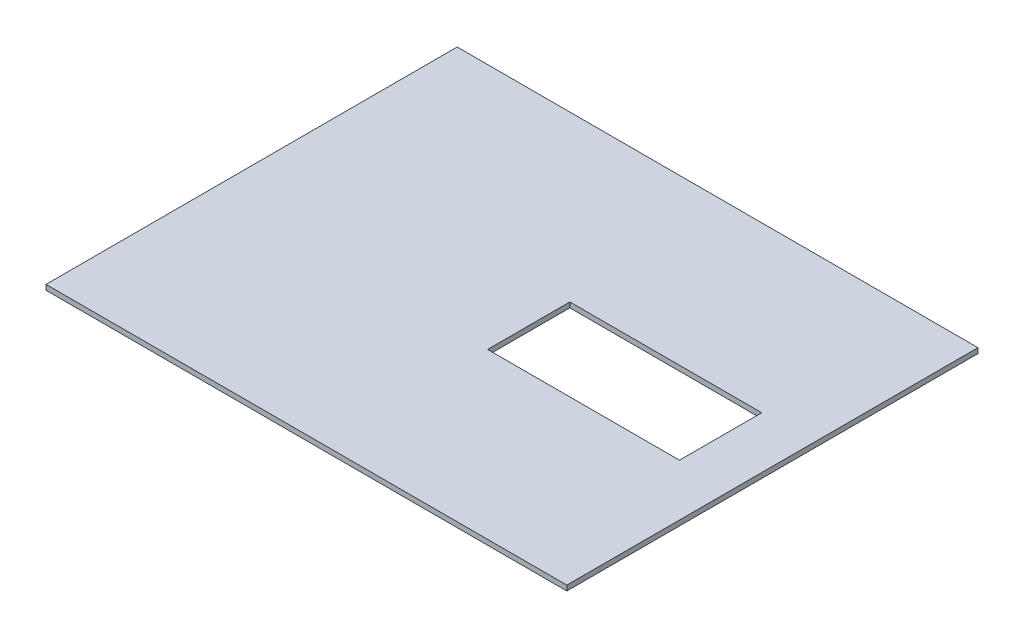
ISO-10303-21;
HEADER;
FILE_DESCRIPTION(('STEP AP214'),'2;1');
FILE_NAME('part.step','',(''),(''),'','','');
FILE_SCHEMA(('AUTOMOTIVE_DESIGN { 1 0 10303 214 1 1 1 1 }'));
ENDSEC;
DATA;
#1=APPLICATION_CONTEXT('core data for automotive mechanical design processes');
#2=APPLICATION_PROTOCOL_DEFINITION('international standard','automotive_design',2000,#1);
#3=PRODUCT_CONTEXT('',#1,'mechanical');
#4=PRODUCT('Part','Part','',(#3));
#5=PRODUCT_RELATED_PRODUCT_CATEGORY('part','',(#4));
#6=PRODUCT_DEFINITION_FORMATION('','',#4);
#7=PRODUCT_DEFINITION_CONTEXT('part definition',#1,'design');
#8=PRODUCT_DEFINITION('design','',#6,#7);
#9=PRODUCT_DEFINITION_SHAPE('','',#8);
#10=(LENGTH_UNIT() NAMED_UNIT(*) SI_UNIT(.MILLI.,.METRE.));
#11=(NAMED_UNIT(*) PLANE_ANGLE_UNIT() SI_UNIT($,.RADIAN.));
#12=(NAMED_UNIT(*) SI_UNIT($,.STERADIAN.) SOLID_ANGLE_UNIT());
#13=UNCERTAINTY_MEASURE_WITH_UNIT(LENGTH_MEASURE(1.E-05),#10,'distance_accuracy_value','');
#14=(GEOMETRIC_REPRESENTATION_CONTEXT(3) GLOBAL_UNCERTAINTY_ASSIGNED_CONTEXT((#13)) GLOBAL_UNIT_ASSIGNED_CONTEXT((#10,
#11,#12)) REPRESENTATION_CONTEXT('',''));
#15=CARTESIAN_POINT('',(0.,0.,0.));
#16=DIRECTION('',(0.,0.,1.));
#17=DIRECTION('',(1.,0.,0.));
#18=AXIS2_PLACEMENT_3D('',#15,#16,#17);
#19=CARTESIAN_POINT('',(241.3,4.7625,-190.5));
#20=DIRECTION('',(-1.,0.,0.));
#21=DIRECTION('',(0.,0.,1.));
#22=AXIS2_PLACEMENT_3D('',#19,#20,#21);
#23=PLANE('',#22);
#24=DIRECTION('',(0.,0.,-1.));
#25=VECTOR('',#24,1.);
#26=CARTESIAN_POINT('',(241.3,0.,-190.5));
#27=LINE('',#26,#25);
#28=CARTESIAN_POINT('',(241.3,0.,190.5));
#29=VERTEX_POINT('',#28);
#30=CARTESIAN_POINT('',(241.3,0.,-190.5));
#31=VERTEX_POINT('',#30);
#32=EDGE_CURVE('E127',#29,#31,#27,.T.);
#33=ORIENTED_EDGE('',*,*,#32,.T.);
#34=DIRECTION('',(0.,-1.,0.));
#35=VECTOR('',#34,1.);
#36=CARTESIAN_POINT('',(241.3,4.7625,-190.5));
#37=LINE('',#36,#35);
#38=CARTESIAN_POINT('',(241.3,4.7625,-190.5));
#39=VERTEX_POINT('',#38);
#40=EDGE_CURVE('E11',#39,#31,#37,.T.);
#41=ORIENTED_EDGE('',*,*,#40,.F.);
#42=DIRECTION('',(0.,0.,-1.));
#43=VECTOR('',#42,1.);
#44=CARTESIAN_POINT('',(241.3,4.7625,-190.5));
#45=LINE('',#44,#43);
#46=CARTESIAN_POINT('',(241.3,4.7625,190.5));
#47=VERTEX_POINT('',#46);
#48=EDGE_CURVE('E129',#47,#39,#45,.T.);
#49=ORIENTED_EDGE('',*,*,#48,.F.);
#50=DIRECTION('',(0.,-1.,0.));
#51=VECTOR('',#50,1.);
#52=CARTESIAN_POINT('',(241.3,4.7625,190.5));
#53=LINE('',#52,#51);
#54=EDGE_CURVE('E139',#47,#29,#53,.T.);
#55=ORIENTED_EDGE('',*,*,#54,.T.);
#56=EDGE_LOOP('',(#33,#41,#49,#55));
#57=FACE_BOUND('',#56,.T.);
#58=ADVANCED_FACE('F33',(#57),#23,.F.);
#59=CARTESIAN_POINT('',(-241.3,4.7625,-190.5));
#60=DIRECTION('',(0.,0.,1.));
#61=DIRECTION('',(1.,0.,0.));
#62=AXIS2_PLACEMENT_3D('',#59,#60,#61);
#63=PLANE('',#62);
#64=DIRECTION('',(-1.,0.,0.));
#65=VECTOR('',#64,1.);
#66=CARTESIAN_POINT('',(-241.3,0.,-190.5));
#67=LINE('',#66,#65);
#68=CARTESIAN_POINT('',(-241.3,0.,-190.5));
#69=VERTEX_POINT('',#68);
#70=EDGE_CURVE('E142',#31,#69,#67,.T.);
#71=ORIENTED_EDGE('',*,*,#70,.T.);
#72=DIRECTION('',(0.,-1.,0.));
#73=VECTOR('',#72,1.);
#74=CARTESIAN_POINT('',(-241.3,4.7625,-190.5));
#75=LINE('',#74,#73);
#76=CARTESIAN_POINT('',(-241.3,4.7625,-190.5));
#77=VERTEX_POINT('',#76);
#78=EDGE_CURVE('E40',#77,#69,#75,.T.);
#79=ORIENTED_EDGE('',*,*,#78,.F.);
#80=DIRECTION('',(-1.,0.,0.));
#81=VECTOR('',#80,1.);
#82=CARTESIAN_POINT('',(-241.3,4.7625,-190.5));
#83=LINE('',#82,#81);
#84=EDGE_CURVE('E132',#39,#77,#83,.T.);
#85=ORIENTED_EDGE('',*,*,#84,.F.);
#86=ORIENTED_EDGE('',*,*,#40,.T.);
#87=EDGE_LOOP('',(#71,#79,#85,#86));
#88=FACE_BOUND('',#87,.T.);
#89=ADVANCED_FACE('F170',(#88),#63,.F.);
#90=CARTESIAN_POINT('',(-241.3,4.7625,-190.5));
#91=DIRECTION('',(1.,0.,0.));
#92=DIRECTION('',(0.,0.,-1.));
#93=AXIS2_PLACEMENT_3D('',#90,#91,#92);
#94=PLANE('',#93);
#95=DIRECTION('',(0.,0.,1.));
#96=VECTOR('',#95,1.);
#97=CARTESIAN_POINT('',(-241.3,0.,-190.5));
#98=LINE('',#97,#96);
#99=CARTESIAN_POINT('',(-241.3,0.,190.5));
#100=VERTEX_POINT('',#99);
#101=EDGE_CURVE('E144',#69,#100,#98,.T.);
#102=ORIENTED_EDGE('',*,*,#101,.T.);
#103=DIRECTION('',(0.,-1.,0.));
#104=VECTOR('',#103,1.);
#105=CARTESIAN_POINT('',(-241.3,4.7625,190.5));
#106=LINE('',#105,#104);
#107=CARTESIAN_POINT('',(-241.3,4.7625,190.5));
#108=VERTEX_POINT('',#107);
#109=EDGE_CURVE('E149',#108,#100,#106,.T.);
#110=ORIENTED_EDGE('',*,*,#109,.F.);
#111=DIRECTION('',(0.,0.,1.));
#112=VECTOR('',#111,1.);
#113=CARTESIAN_POINT('',(-241.3,4.7625,-190.5));
#114=LINE('',#113,#112);
#115=EDGE_CURVE('E135',#77,#108,#114,.T.);
#116=ORIENTED_EDGE('',*,*,#115,.F.);
#117=ORIENTED_EDGE('',*,*,#78,.T.);
#118=EDGE_LOOP('',(#102,#110,#116,#117));
#119=FACE_BOUND('',#118,.T.);
#120=ADVANCED_FACE('F156',(#119),#94,.F.);
#121=CARTESIAN_POINT('',(-241.3,4.7625,190.5));
#122=DIRECTION('',(0.,0.,-1.));
#123=DIRECTION('',(-1.,0.,0.));
#124=AXIS2_PLACEMENT_3D('',#121,#122,#123);
#125=PLANE('',#124);
#126=DIRECTION('',(1.,0.,0.));
#127=VECTOR('',#126,1.);
#128=CARTESIAN_POINT('',(-241.3,0.,190.5));
#129=LINE('',#128,#127);
#130=EDGE_CURVE('E133',#100,#29,#129,.T.);
#131=ORIENTED_EDGE('',*,*,#130,.T.);
#132=ORIENTED_EDGE('',*,*,#54,.F.);
#133=DIRECTION('',(1.,0.,0.));
#134=VECTOR('',#133,1.);
#135=CARTESIAN_POINT('',(-241.3,4.7625,190.5));
#136=LINE('',#135,#134);
#137=EDGE_CURVE('E137',#108,#47,#136,.T.);
#138=ORIENTED_EDGE('',*,*,#137,.F.);
#139=ORIENTED_EDGE('',*,*,#109,.T.);
#140=EDGE_LOOP('',(#131,#132,#138,#139));
#141=FACE_BOUND('',#140,.T.);
#142=ADVANCED_FACE('F165',(#141),#125,.F.);
#143=CARTESIAN_POINT('',(0.,4.7625,0.));
#144=DIRECTION('',(0.,1.,0.));
#145=DIRECTION('',(0.,0.,1.));
#146=AXIS2_PLACEMENT_3D('',#143,#144,#145);
#147=PLANE('',#146);
#148=DIRECTION('',(0.,0.,-1.));
#149=VECTOR('',#148,1.);
#150=CARTESIAN_POINT('',(193.294,4.7625,38.1));
#151=LINE('',#150,#149);
#152=CARTESIAN_POINT('',(193.294,4.7625,38.1));
#153=VERTEX_POINT('',#152);
#154=CARTESIAN_POINT('',(193.294,4.7625,-38.1));
#155=VERTEX_POINT('',#154);
#156=EDGE_CURVE('E47',#153,#155,#151,.T.);
#157=ORIENTED_EDGE('',*,*,#156,.F.);
#158=DIRECTION('',(1.,0.,0.));
#159=VECTOR('',#158,1.);
#160=CARTESIAN_POINT('',(193.294,4.7625,38.1));
#161=LINE('',#160,#159);
#162=CARTESIAN_POINT('',(15.494,4.7625,38.1));
#163=VERTEX_POINT('',#162);
#164=EDGE_CURVE('E116',#163,#153,#161,.T.);
#165=ORIENTED_EDGE('',*,*,#164,.F.);
#166=DIRECTION('',(0.,0.,1.));
#167=VECTOR('',#166,1.);
#168=CARTESIAN_POINT('',(15.494,4.7625,38.1));
#169=LINE('',#168,#167);
#170=CARTESIAN_POINT('',(15.494,4.7625,-38.1));
#171=VERTEX_POINT('',#170);
#172=EDGE_CURVE('E100',#171,#163,#169,.T.);
#173=ORIENTED_EDGE('',*,*,#172,.F.);
#174=DIRECTION('',(-1.,0.,0.));
#175=VECTOR('',#174,1.);
#176=CARTESIAN_POINT('',(193.294,4.7625,-38.1));
#177=LINE('',#176,#175);
#178=EDGE_CURVE('E109',#155,#171,#177,.T.);
#179=ORIENTED_EDGE('',*,*,#178,.F.);
#180=EDGE_LOOP('',(#157,#165,#173,#179));
#181=FACE_BOUND('',#180,.T.);
#182=ORIENTED_EDGE('',*,*,#48,.T.);
#183=ORIENTED_EDGE('',*,*,#84,.T.);
#184=ORIENTED_EDGE('',*,*,#115,.T.);
#185=ORIENTED_EDGE('',*,*,#137,.T.);
#186=EDGE_LOOP('',(#182,#183,#184,#185));
#187=FACE_BOUND('',#186,.T.);
#188=ADVANCED_FACE('F113',(#181,#187),#147,.T.);
#189=CARTESIAN_POINT('',(0.,0.,0.));
#190=DIRECTION('',(0.,1.,0.));
#191=DIRECTION('',(0.,0.,1.));
#192=AXIS2_PLACEMENT_3D('',#189,#190,#191);
#193=PLANE('',#192);
#194=DIRECTION('',(-1.,0.,0.));
#195=VECTOR('',#194,1.);
#196=CARTESIAN_POINT('',(193.294,0.,38.1));
#197=LINE('',#196,#195);
#198=CARTESIAN_POINT('',(193.294,0.,38.1));
#199=VERTEX_POINT('',#198);
#200=CARTESIAN_POINT('',(15.494,0.,38.1));
#201=VERTEX_POINT('',#200);
#202=EDGE_CURVE('E199',#199,#201,#197,.T.);
#203=ORIENTED_EDGE('',*,*,#202,.F.);
#204=DIRECTION('',(0.,0.,1.));
#205=VECTOR('',#204,1.);
#206=CARTESIAN_POINT('',(193.294,0.,38.1));
#207=LINE('',#206,#205);
#208=CARTESIAN_POINT('',(193.294,0.,-38.1));
#209=VERTEX_POINT('',#208);
#210=EDGE_CURVE('E128',#209,#199,#207,.T.);
#211=ORIENTED_EDGE('',*,*,#210,.F.);
#212=DIRECTION('',(1.,0.,0.));
#213=VECTOR('',#212,1.);
#214=CARTESIAN_POINT('',(193.294,0.,-38.1));
#215=LINE('',#214,#213);
#216=CARTESIAN_POINT('',(15.494,0.,-38.1));
#217=VERTEX_POINT('',#216);
#218=EDGE_CURVE('E125',#217,#209,#215,.T.);
#219=ORIENTED_EDGE('',*,*,#218,.F.);
#220=DIRECTION('',(0.,0.,-1.));
#221=VECTOR('',#220,1.);
#222=CARTESIAN_POINT('',(15.494,0.,38.1));
#223=LINE('',#222,#221);
#224=EDGE_CURVE('E103',#201,#217,#223,.T.);
#225=ORIENTED_EDGE('',*,*,#224,.F.);
#226=EDGE_LOOP('',(#203,#211,#219,#225));
#227=FACE_BOUND('',#226,.T.);
#228=ORIENTED_EDGE('',*,*,#32,.F.);
#229=ORIENTED_EDGE('',*,*,#130,.F.);
#230=ORIENTED_EDGE('',*,*,#101,.F.);
#231=ORIENTED_EDGE('',*,*,#70,.F.);
#232=EDGE_LOOP('',(#228,#229,#230,#231));
#233=FACE_BOUND('',#232,.T.);
#234=ADVANCED_FACE('F162',(#227,#233),#193,.F.);
#235=CARTESIAN_POINT('',(193.294,-193.440636888943,38.1));
#236=DIRECTION('',(1.,0.,0.));
#237=DIRECTION('',(0.,0.,-1.));
#238=AXIS2_PLACEMENT_3D('',#235,#236,#237);
#239=PLANE('',#238);
#240=ORIENTED_EDGE('',*,*,#210,.T.);
#241=DIRECTION('',(0.,1.,0.));
#242=VECTOR('',#241,1.);
#243=CARTESIAN_POINT('',(193.294,-193.440636888943,38.1));
#244=LINE('',#243,#242);
#245=EDGE_CURVE('E121',#199,#153,#244,.T.);
#246=ORIENTED_EDGE('',*,*,#245,.T.);
#247=ORIENTED_EDGE('',*,*,#156,.T.);
#248=DIRECTION('',(0.,1.,0.));
#249=VECTOR('',#248,1.);
#250=CARTESIAN_POINT('',(193.294,-193.440636888943,-38.1));
#251=LINE('',#250,#249);
#252=EDGE_CURVE('E106',#209,#155,#251,.T.);
#253=ORIENTED_EDGE('',*,*,#252,.F.);
#254=EDGE_LOOP('',(#240,#246,#247,#253));
#255=FACE_BOUND('',#254,.T.);
#256=ADVANCED_FACE('F182',(#255),#239,.F.);
#257=CARTESIAN_POINT('',(193.294,-193.440636888943,38.1));
#258=DIRECTION('',(0.,0.,1.));
#259=DIRECTION('',(1.,0.,0.));
#260=AXIS2_PLACEMENT_3D('',#257,#258,#259);
#261=PLANE('',#260);
#262=ORIENTED_EDGE('',*,*,#202,.T.);
#263=DIRECTION('',(0.,1.,0.));
#264=VECTOR('',#263,1.);
#265=CARTESIAN_POINT('',(15.494,-193.440636888943,38.1));
#266=LINE('',#265,#264);
#267=EDGE_CURVE('E105',#201,#163,#266,.T.);
#268=ORIENTED_EDGE('',*,*,#267,.T.);
#269=ORIENTED_EDGE('',*,*,#164,.T.);
#270=ORIENTED_EDGE('',*,*,#245,.F.);
#271=EDGE_LOOP('',(#262,#268,#269,#270));
#272=FACE_BOUND('',#271,.T.);
#273=ADVANCED_FACE('F188',(#272),#261,.F.);
#274=CARTESIAN_POINT('',(15.494,-193.440636888943,38.1));
#275=DIRECTION('',(-1.,0.,0.));
#276=DIRECTION('',(0.,0.,1.));
#277=AXIS2_PLACEMENT_3D('',#274,#275,#276);
#278=PLANE('',#277);
#279=ORIENTED_EDGE('',*,*,#224,.T.);
#280=DIRECTION('',(0.,1.,0.));
#281=VECTOR('',#280,1.);
#282=CARTESIAN_POINT('',(15.494,-193.440636888943,-38.1));
#283=LINE('',#282,#281);
#284=EDGE_CURVE('E55',#217,#171,#283,.T.);
#285=ORIENTED_EDGE('',*,*,#284,.T.);
#286=ORIENTED_EDGE('',*,*,#172,.T.);
#287=ORIENTED_EDGE('',*,*,#267,.F.);
#288=EDGE_LOOP('',(#279,#285,#286,#287));
#289=FACE_BOUND('',#288,.T.);
#290=ADVANCED_FACE('F97',(#289),#278,.F.);
#291=CARTESIAN_POINT('',(193.294,-193.440636888943,-38.1));
#292=DIRECTION('',(0.,0.,-1.));
#293=DIRECTION('',(-1.,0.,0.));
#294=AXIS2_PLACEMENT_3D('',#291,#292,#293);
#295=PLANE('',#294);
#296=ORIENTED_EDGE('',*,*,#218,.T.);
#297=ORIENTED_EDGE('',*,*,#252,.T.);
#298=ORIENTED_EDGE('',*,*,#178,.T.);
#299=ORIENTED_EDGE('',*,*,#284,.F.);
#300=EDGE_LOOP('',(#296,#297,#298,#299));
#301=FACE_BOUND('',#300,.T.);
#302=ADVANCED_FACE('F110',(#301),#295,.F.);
#303=CLOSED_SHELL('',(#58,#89,#120,#142,#188,#234,#256,#273,#290,#302));
#304=MANIFOLD_SOLID_BREP('B2',#303);
#305=ADVANCED_BREP_SHAPE_REPRESENTATION('',(#18,#304),#14);
#306=SHAPE_DEFINITION_REPRESENTATION(#9,#305);
ENDSEC;
END-ISO-10303-21;
